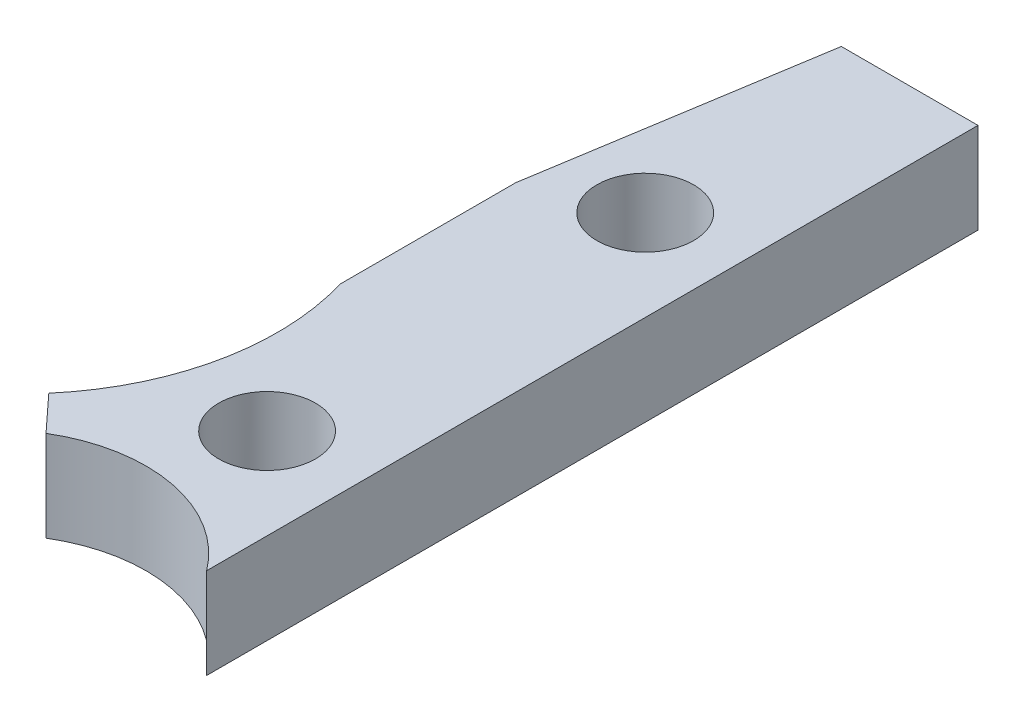
ISO-10303-21;
HEADER;
FILE_DESCRIPTION(('STEP AP214'),'2;1');
FILE_NAME('part.step','',(''),(''),'','','');
FILE_SCHEMA(('AUTOMOTIVE_DESIGN { 1 0 10303 214 1 1 1 1 }'));
ENDSEC;
DATA;
#1=APPLICATION_CONTEXT('core data for automotive mechanical design processes');
#2=APPLICATION_PROTOCOL_DEFINITION('international standard','automotive_design',2000,#1);
#3=PRODUCT_CONTEXT('',#1,'mechanical');
#4=PRODUCT('Part','Part','',(#3));
#5=PRODUCT_RELATED_PRODUCT_CATEGORY('part','',(#4));
#6=PRODUCT_DEFINITION_FORMATION('','',#4);
#7=PRODUCT_DEFINITION_CONTEXT('part definition',#1,'design');
#8=PRODUCT_DEFINITION('design','',#6,#7);
#9=PRODUCT_DEFINITION_SHAPE('','',#8);
#10=(LENGTH_UNIT() NAMED_UNIT(*) SI_UNIT(.MILLI.,.METRE.));
#11=(NAMED_UNIT(*) PLANE_ANGLE_UNIT() SI_UNIT($,.RADIAN.));
#12=(NAMED_UNIT(*) SI_UNIT($,.STERADIAN.) SOLID_ANGLE_UNIT());
#13=UNCERTAINTY_MEASURE_WITH_UNIT(LENGTH_MEASURE(1.E-05),#10,'distance_accuracy_value','');
#14=(GEOMETRIC_REPRESENTATION_CONTEXT(3) GLOBAL_UNCERTAINTY_ASSIGNED_CONTEXT((#13)) GLOBAL_UNIT_ASSIGNED_CONTEXT((#10,
#11,#12)) REPRESENTATION_CONTEXT('',''));
#15=CARTESIAN_POINT('',(0.,0.,0.));
#16=DIRECTION('',(0.,0.,1.));
#17=DIRECTION('',(1.,0.,0.));
#18=AXIS2_PLACEMENT_3D('',#15,#16,#17);
#19=CARTESIAN_POINT('',(0.,0.,0.));
#20=DIRECTION('',(0.,1.,0.));
#21=DIRECTION('',(1.,0.,0.));
#22=AXIS2_PLACEMENT_3D('',#19,#20,#21);
#23=PLANE('',#22);
#24=DIRECTION('',(0.,0.,-1.));
#25=VECTOR('',#24,1.);
#26=CARTESIAN_POINT('',(14.15,0.,8.));
#27=LINE('',#26,#25);
#28=CARTESIAN_POINT('',(14.15,0.,8.));
#29=VERTEX_POINT('',#28);
#30=CARTESIAN_POINT('',(14.15,0.,-17.5));
#31=VERTEX_POINT('',#30);
#32=EDGE_CURVE('E35',#29,#31,#27,.T.);
#33=ORIENTED_EDGE('',*,*,#32,.F.);
#34=CARTESIAN_POINT('',(10.15,0.,11.));
#35=DIRECTION('',(0.,1.,0.));
#36=DIRECTION('',(0.8,0.,-0.6));
#37=AXIS2_PLACEMENT_3D('',#34,#35,#36);
#38=CIRCLE('',#37,5.);
#39=CARTESIAN_POINT('',(7.56273097412,0.,6.721444287178));
#40=VERTEX_POINT('',#39);
#41=EDGE_CURVE('E11',#29,#40,#38,.T.);
#42=ORIENTED_EDGE('',*,*,#41,.T.);
#43=DIRECTION('',(-0.678141343769995,0.,-0.734931505563495));
#44=VECTOR('',#43,1.);
#45=CARTESIAN_POINT('',(7.56273097412,0.,6.721444287178));
#46=LINE('',#45,#44);
#47=CARTESIAN_POINT('',(6.459103266768,0.,5.525394555073));
#48=VERTEX_POINT('',#47);
#49=EDGE_CURVE('E27',#40,#48,#46,.T.);
#50=ORIENTED_EDGE('',*,*,#49,.T.);
#51=CARTESIAN_POINT('',(0.,0.,0.));
#52=DIRECTION('',(0.,1.,0.));
#53=DIRECTION('',(0.759894501972726,0.,0.650046418243822));
#54=AXIS2_PLACEMENT_3D('',#51,#52,#53);
#55=CIRCLE('',#54,8.5);
#56=CARTESIAN_POINT('',(8.15,0.,-2.414021540915));
#57=VERTEX_POINT('',#56);
#58=EDGE_CURVE('E149',#48,#57,#55,.T.);
#59=ORIENTED_EDGE('',*,*,#58,.T.);
#60=DIRECTION('',(0.,0.,-1.));
#61=VECTOR('',#60,1.);
#62=CARTESIAN_POINT('',(8.15,0.,-2.414021540915));
#63=LINE('',#62,#61);
#64=CARTESIAN_POINT('',(8.15,0.,-8.219053391277));
#65=VERTEX_POINT('',#64);
#66=EDGE_CURVE('E145',#57,#65,#63,.T.);
#67=ORIENTED_EDGE('',*,*,#66,.T.);
#68=DIRECTION('',(-0.157736652180697,0.,0.98748121428148));
#69=VECTOR('',#68,1.);
#70=CARTESIAN_POINT('',(9.632504604599,0.,-17.5));
#71=LINE('',#70,#69);
#72=CARTESIAN_POINT('',(9.632504604599,0.,-17.5));
#73=VERTEX_POINT('',#72);
#74=EDGE_CURVE('E120',#73,#65,#71,.T.);
#75=ORIENTED_EDGE('',*,*,#74,.F.);
#76=DIRECTION('',(1.,0.,0.));
#77=VECTOR('',#76,1.);
#78=CARTESIAN_POINT('',(9.632504604599,0.,-17.5));
#79=LINE('',#78,#77);
#80=EDGE_CURVE('E144',#73,#31,#79,.T.);
#81=ORIENTED_EDGE('',*,*,#80,.T.);
#82=EDGE_LOOP('',(#33,#42,#50,#59,#67,#75,#81));
#83=FACE_BOUND('',#82,.T.);
#84=CARTESIAN_POINT('',(11.15,0.,3.));
#85=DIRECTION('',(0.,-1.,0.));
#86=DIRECTION('',(-1.,0.,0.));
#87=AXIS2_PLACEMENT_3D('',#84,#85,#86);
#88=CIRCLE('',#87,1.6);
#89=CARTESIAN_POINT('',(9.55,0.,3.));
#90=VERTEX_POINT('',#89);
#91=EDGE_CURVE('E141',#90,#90,#88,.T.);
#92=ORIENTED_EDGE('',*,*,#91,.F.);
#93=EDGE_LOOP('',(#92));
#94=FACE_BOUND('',#93,.T.);
#95=CARTESIAN_POINT('',(11.15,0.,-9.5));
#96=DIRECTION('',(0.,-1.,0.));
#97=DIRECTION('',(-1.,0.,0.));
#98=AXIS2_PLACEMENT_3D('',#95,#96,#97);
#99=CIRCLE('',#98,1.6);
#100=CARTESIAN_POINT('',(9.55,0.,-9.5));
#101=VERTEX_POINT('',#100);
#102=EDGE_CURVE('E132',#101,#101,#99,.T.);
#103=ORIENTED_EDGE('',*,*,#102,.F.);
#104=EDGE_LOOP('',(#103));
#105=FACE_BOUND('',#104,.T.);
#106=ADVANCED_FACE('F17',(#83,#94,#105),#23,.F.);
#107=CARTESIAN_POINT('',(11.15,3.,3.));
#108=DIRECTION('',(0.,-1.,0.));
#109=DIRECTION('',(1.,0.,0.));
#110=AXIS2_PLACEMENT_3D('',#107,#108,#109);
#111=CYLINDRICAL_SURFACE('',#110,1.6);
#112=ORIENTED_EDGE('',*,*,#91,.T.);
#113=EDGE_LOOP('',(#112));
#114=FACE_BOUND('',#113,.T.);
#115=CARTESIAN_POINT('',(11.15,3.,3.));
#116=DIRECTION('',(0.,-1.,0.));
#117=DIRECTION('',(1.,0.,0.));
#118=AXIS2_PLACEMENT_3D('',#115,#116,#117);
#119=CIRCLE('',#118,1.6);
#120=CARTESIAN_POINT('',(12.75,3.,3.));
#121=VERTEX_POINT('',#120);
#122=EDGE_CURVE('E96',#121,#121,#119,.T.);
#123=ORIENTED_EDGE('',*,*,#122,.F.);
#124=EDGE_LOOP('',(#123));
#125=FACE_BOUND('',#124,.T.);
#126=ADVANCED_FACE('F168',(#114,#125),#111,.F.);
#127=CARTESIAN_POINT('',(0.,3.,0.));
#128=DIRECTION('',(0.,1.,0.));
#129=DIRECTION('',(1.,0.,0.));
#130=AXIS2_PLACEMENT_3D('',#127,#128,#129);
#131=PLANE('',#130);
#132=DIRECTION('',(-0.157736652180697,0.,0.98748121428148));
#133=VECTOR('',#132,1.);
#134=CARTESIAN_POINT('',(9.632504604599,3.,-17.5));
#135=LINE('',#134,#133);
#136=CARTESIAN_POINT('',(9.632504604599,3.,-17.5));
#137=VERTEX_POINT('',#136);
#138=CARTESIAN_POINT('',(8.15,3.,-8.219053391277));
#139=VERTEX_POINT('',#138);
#140=EDGE_CURVE('E95',#137,#139,#135,.T.);
#141=ORIENTED_EDGE('',*,*,#140,.T.);
#142=DIRECTION('',(0.,0.,-1.));
#143=VECTOR('',#142,1.);
#144=CARTESIAN_POINT('',(8.15,3.,-2.414021540915));
#145=LINE('',#144,#143);
#146=CARTESIAN_POINT('',(8.15,3.,-2.414021540915));
#147=VERTEX_POINT('',#146);
#148=EDGE_CURVE('E115',#147,#139,#145,.T.);
#149=ORIENTED_EDGE('',*,*,#148,.F.);
#150=CARTESIAN_POINT('',(0.,3.,0.));
#151=DIRECTION('',(0.,1.,0.));
#152=DIRECTION('',(0.759894501972726,0.,0.650046418243822));
#153=AXIS2_PLACEMENT_3D('',#150,#151,#152);
#154=CIRCLE('',#153,8.5);
#155=CARTESIAN_POINT('',(6.459103266768,3.,5.525394555073));
#156=VERTEX_POINT('',#155);
#157=EDGE_CURVE('E112',#156,#147,#154,.T.);
#158=ORIENTED_EDGE('',*,*,#157,.F.);
#159=DIRECTION('',(-0.678141343769995,0.,-0.734931505563495));
#160=VECTOR('',#159,1.);
#161=CARTESIAN_POINT('',(7.56273097412,3.,6.721444287178));
#162=LINE('',#161,#160);
#163=CARTESIAN_POINT('',(7.56273097412,3.,6.721444287178));
#164=VERTEX_POINT('',#163);
#165=EDGE_CURVE('E109',#164,#156,#162,.T.);
#166=ORIENTED_EDGE('',*,*,#165,.F.);
#167=CARTESIAN_POINT('',(10.15,3.,11.));
#168=DIRECTION('',(0.,1.,0.));
#169=DIRECTION('',(0.8,0.,-0.6));
#170=AXIS2_PLACEMENT_3D('',#167,#168,#169);
#171=CIRCLE('',#170,5.);
#172=CARTESIAN_POINT('',(14.15,3.,8.));
#173=VERTEX_POINT('',#172);
#174=EDGE_CURVE('E73',#173,#164,#171,.T.);
#175=ORIENTED_EDGE('',*,*,#174,.F.);
#176=DIRECTION('',(0.,0.,-1.));
#177=VECTOR('',#176,1.);
#178=CARTESIAN_POINT('',(14.15,3.,8.));
#179=LINE('',#178,#177);
#180=CARTESIAN_POINT('',(14.15,3.,-17.5));
#181=VERTEX_POINT('',#180);
#182=EDGE_CURVE('E89',#173,#181,#179,.T.);
#183=ORIENTED_EDGE('',*,*,#182,.T.);
#184=DIRECTION('',(1.,0.,0.));
#185=VECTOR('',#184,1.);
#186=CARTESIAN_POINT('',(9.632504604599,3.,-17.5));
#187=LINE('',#186,#185);
#188=EDGE_CURVE('E79',#137,#181,#187,.T.);
#189=ORIENTED_EDGE('',*,*,#188,.F.);
#190=EDGE_LOOP('',(#141,#149,#158,#166,#175,#183,#189));
#191=FACE_BOUND('',#190,.T.);
#192=ORIENTED_EDGE('',*,*,#122,.T.);
#193=EDGE_LOOP('',(#192));
#194=FACE_BOUND('',#193,.T.);
#195=CARTESIAN_POINT('',(11.15,3.,-9.5));
#196=DIRECTION('',(0.,-1.,0.));
#197=DIRECTION('',(-1.,0.,0.));
#198=AXIS2_PLACEMENT_3D('',#195,#196,#197);
#199=CIRCLE('',#198,1.6);
#200=CARTESIAN_POINT('',(9.55,3.,-9.5));
#201=VERTEX_POINT('',#200);
#202=EDGE_CURVE('E130',#201,#201,#199,.T.);
#203=ORIENTED_EDGE('',*,*,#202,.T.);
#204=EDGE_LOOP('',(#203));
#205=FACE_BOUND('',#204,.T.);
#206=ADVANCED_FACE('F90',(#191,#194,#205),#131,.T.);
#207=CARTESIAN_POINT('',(11.15,3.,-9.5));
#208=DIRECTION('',(0.,-1.,0.));
#209=DIRECTION('',(1.,0.,0.));
#210=AXIS2_PLACEMENT_3D('',#207,#208,#209);
#211=CYLINDRICAL_SURFACE('',#210,1.6);
#212=ORIENTED_EDGE('',*,*,#102,.T.);
#213=EDGE_LOOP('',(#212));
#214=FACE_BOUND('',#213,.T.);
#215=ORIENTED_EDGE('',*,*,#202,.F.);
#216=EDGE_LOOP('',(#215));
#217=FACE_BOUND('',#216,.T.);
#218=ADVANCED_FACE('F178',(#214,#217),#211,.F.);
#219=CARTESIAN_POINT('',(0.,3.,-17.5));
#220=DIRECTION('',(0.,0.,1.));
#221=DIRECTION('',(1.,0.,0.));
#222=AXIS2_PLACEMENT_3D('',#219,#220,#221);
#223=PLANE('',#222);
#224=DIRECTION('',(0.,1.,0.));
#225=VECTOR('',#224,1.);
#226=CARTESIAN_POINT('',(9.632504604599,0.,-17.5));
#227=LINE('',#226,#225);
#228=EDGE_CURVE('E85',#73,#137,#227,.T.);
#229=ORIENTED_EDGE('',*,*,#228,.T.);
#230=ORIENTED_EDGE('',*,*,#188,.T.);
#231=DIRECTION('',(0.,1.,0.));
#232=VECTOR('',#231,1.);
#233=CARTESIAN_POINT('',(14.15,0.,-17.5));
#234=LINE('',#233,#232);
#235=EDGE_CURVE('E83',#31,#181,#234,.T.);
#236=ORIENTED_EDGE('',*,*,#235,.F.);
#237=ORIENTED_EDGE('',*,*,#80,.F.);
#238=EDGE_LOOP('',(#229,#230,#236,#237));
#239=FACE_BOUND('',#238,.T.);
#240=ADVANCED_FACE('F80',(#239),#223,.F.);
#241=CARTESIAN_POINT('',(14.15,0.,11.));
#242=DIRECTION('',(1.,0.,0.));
#243=DIRECTION('',(0.,0.,-1.));
#244=AXIS2_PLACEMENT_3D('',#241,#242,#243);
#245=PLANE('',#244);
#246=ORIENTED_EDGE('',*,*,#182,.F.);
#247=DIRECTION('',(0.,1.,0.));
#248=VECTOR('',#247,1.);
#249=CARTESIAN_POINT('',(14.15,0.,8.));
#250=LINE('',#249,#248);
#251=EDGE_CURVE('E99',#29,#173,#250,.T.);
#252=ORIENTED_EDGE('',*,*,#251,.F.);
#253=ORIENTED_EDGE('',*,*,#32,.T.);
#254=ORIENTED_EDGE('',*,*,#235,.T.);
#255=EDGE_LOOP('',(#246,#252,#253,#254));
#256=FACE_BOUND('',#255,.T.);
#257=ADVANCED_FACE('F98',(#256),#245,.T.);
#258=CARTESIAN_POINT('',(10.15,3.,11.));
#259=DIRECTION('',(0.,1.,0.));
#260=DIRECTION('',(1.,0.,0.));
#261=AXIS2_PLACEMENT_3D('',#258,#259,#260);
#262=CYLINDRICAL_SURFACE('',#261,5.);
#263=ORIENTED_EDGE('',*,*,#251,.T.);
#264=ORIENTED_EDGE('',*,*,#174,.T.);
#265=DIRECTION('',(0.,-1.,0.));
#266=VECTOR('',#265,1.);
#267=CARTESIAN_POINT('',(7.56273097412,3.,6.721444287178));
#268=LINE('',#267,#266);
#269=EDGE_CURVE('E106',#164,#40,#268,.T.);
#270=ORIENTED_EDGE('',*,*,#269,.T.);
#271=ORIENTED_EDGE('',*,*,#41,.F.);
#272=EDGE_LOOP('',(#263,#264,#270,#271));
#273=FACE_BOUND('',#272,.T.);
#274=ADVANCED_FACE('F185',(#273),#262,.F.);
#275=CARTESIAN_POINT('',(7.56273097412,3.,6.721444287178));
#276=DIRECTION('',(0.734931505563495,0.,-0.678141343769995));
#277=DIRECTION('',(-0.678141343769995,0.,-0.734931505563495));
#278=AXIS2_PLACEMENT_3D('',#275,#276,#277);
#279=PLANE('',#278);
#280=ORIENTED_EDGE('',*,*,#269,.F.);
#281=ORIENTED_EDGE('',*,*,#165,.T.);
#282=DIRECTION('',(0.,-1.,0.));
#283=VECTOR('',#282,1.);
#284=CARTESIAN_POINT('',(6.459103266768,3.,5.525394555073));
#285=LINE('',#284,#283);
#286=EDGE_CURVE('E110',#156,#48,#285,.T.);
#287=ORIENTED_EDGE('',*,*,#286,.T.);
#288=ORIENTED_EDGE('',*,*,#49,.F.);
#289=EDGE_LOOP('',(#280,#281,#287,#288));
#290=FACE_BOUND('',#289,.T.);
#291=ADVANCED_FACE('F157',(#290),#279,.F.);
#292=CARTESIAN_POINT('',(0.,3.,0.));
#293=DIRECTION('',(0.,1.,0.));
#294=DIRECTION('',(1.,0.,0.));
#295=AXIS2_PLACEMENT_3D('',#292,#293,#294);
#296=CYLINDRICAL_SURFACE('',#295,8.5);
#297=ORIENTED_EDGE('',*,*,#286,.F.);
#298=ORIENTED_EDGE('',*,*,#157,.T.);
#299=DIRECTION('',(0.,-1.,0.));
#300=VECTOR('',#299,1.);
#301=CARTESIAN_POINT('',(8.15,3.,-2.414021540915));
#302=LINE('',#301,#300);
#303=EDGE_CURVE('E113',#147,#57,#302,.T.);
#304=ORIENTED_EDGE('',*,*,#303,.T.);
#305=ORIENTED_EDGE('',*,*,#58,.F.);
#306=EDGE_LOOP('',(#297,#298,#304,#305));
#307=FACE_BOUND('',#306,.T.);
#308=ADVANCED_FACE('F158',(#307),#296,.F.);
#309=CARTESIAN_POINT('',(8.15,3.,-2.414021540915));
#310=DIRECTION('',(1.,0.,0.));
#311=DIRECTION('',(0.,0.,-1.));
#312=AXIS2_PLACEMENT_3D('',#309,#310,#311);
#313=PLANE('',#312);
#314=ORIENTED_EDGE('',*,*,#303,.F.);
#315=ORIENTED_EDGE('',*,*,#148,.T.);
#316=DIRECTION('',(0.,1.,0.));
#317=VECTOR('',#316,1.);
#318=CARTESIAN_POINT('',(8.15,0.,-8.219053391277));
#319=LINE('',#318,#317);
#320=EDGE_CURVE('E21',#65,#139,#319,.T.);
#321=ORIENTED_EDGE('',*,*,#320,.F.);
#322=ORIENTED_EDGE('',*,*,#66,.F.);
#323=EDGE_LOOP('',(#314,#315,#321,#322));
#324=FACE_BOUND('',#323,.T.);
#325=ADVANCED_FACE('F159',(#324),#313,.F.);
#326=CARTESIAN_POINT('',(11.15,0.,-27.));
#327=DIRECTION('',(-0.98748121428148,0.,-0.157736652180697));
#328=DIRECTION('',(-0.157736652180697,0.,0.98748121428148));
#329=AXIS2_PLACEMENT_3D('',#326,#327,#328);
#330=PLANE('',#329);
#331=ORIENTED_EDGE('',*,*,#74,.T.);
#332=ORIENTED_EDGE('',*,*,#320,.T.);
#333=ORIENTED_EDGE('',*,*,#140,.F.);
#334=ORIENTED_EDGE('',*,*,#228,.F.);
#335=EDGE_LOOP('',(#331,#332,#333,#334));
#336=FACE_BOUND('',#335,.T.);
#337=ADVANCED_FACE('F19',(#336),#330,.T.);
#338=CLOSED_SHELL('',(#106,#126,#206,#218,#240,#257,#274,#291,#308,#325,#337));
#339=MANIFOLD_SOLID_BREP('B1',#338);
#340=ADVANCED_BREP_SHAPE_REPRESENTATION('',(#18,#339),#14);
#341=SHAPE_DEFINITION_REPRESENTATION(#9,#340);
ENDSEC;
END-ISO-10303-21;
